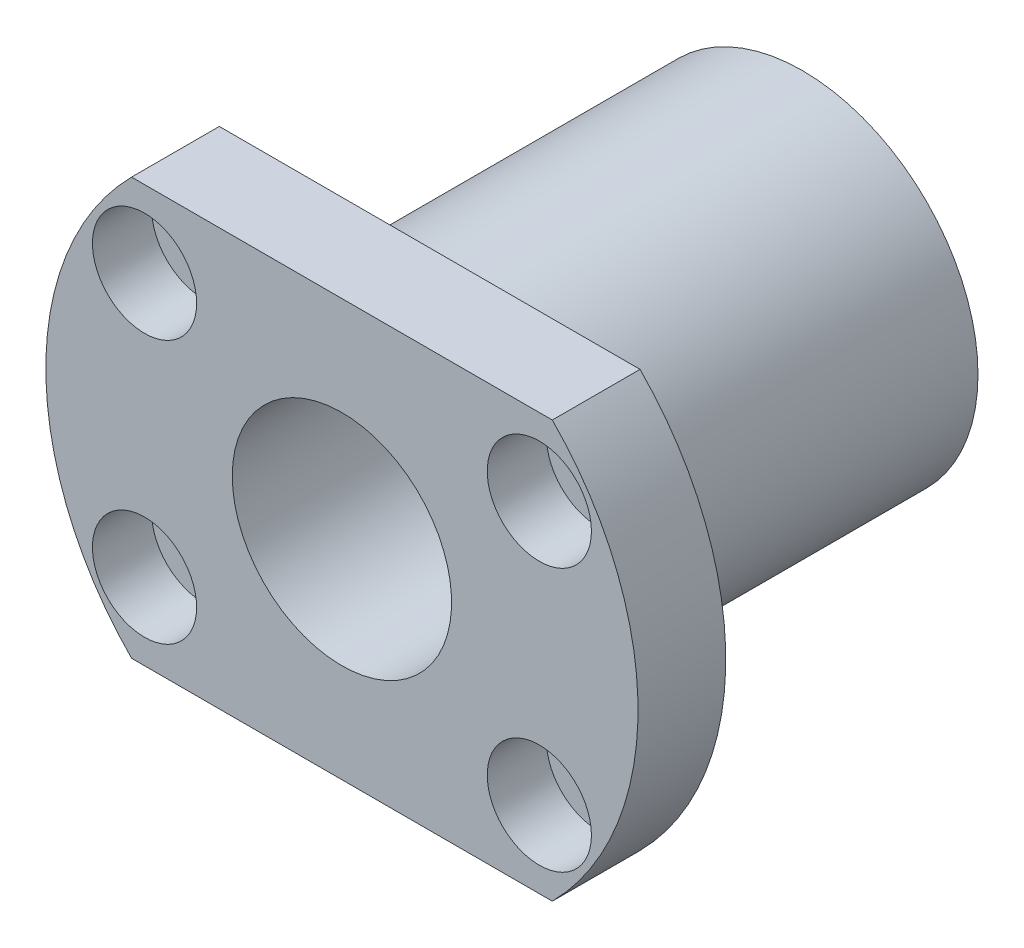
ISO-10303-21;
HEADER;
FILE_DESCRIPTION(('STEP AP214'),'2;1');
FILE_NAME('part.step','',(''),(''),'','','');
FILE_SCHEMA(('AUTOMOTIVE_DESIGN { 1 0 10303 214 1 1 1 1 }'));
ENDSEC;
DATA;
#1=APPLICATION_CONTEXT('core data for automotive mechanical design processes');
#2=APPLICATION_PROTOCOL_DEFINITION('international standard','automotive_design',2000,#1);
#3=PRODUCT_CONTEXT('',#1,'mechanical');
#4=PRODUCT('Part','Part','',(#3));
#5=PRODUCT_RELATED_PRODUCT_CATEGORY('part','',(#4));
#6=PRODUCT_DEFINITION_FORMATION('','',#4);
#7=PRODUCT_DEFINITION_CONTEXT('part definition',#1,'design');
#8=PRODUCT_DEFINITION('design','',#6,#7);
#9=PRODUCT_DEFINITION_SHAPE('','',#8);
#10=(LENGTH_UNIT() NAMED_UNIT(*) SI_UNIT(.MILLI.,.METRE.));
#11=(NAMED_UNIT(*) PLANE_ANGLE_UNIT() SI_UNIT($,.RADIAN.));
#12=(NAMED_UNIT(*) SI_UNIT($,.STERADIAN.) SOLID_ANGLE_UNIT());
#13=UNCERTAINTY_MEASURE_WITH_UNIT(LENGTH_MEASURE(1.E-05),#10,'distance_accuracy_value','');
#14=(GEOMETRIC_REPRESENTATION_CONTEXT(3) GLOBAL_UNCERTAINTY_ASSIGNED_CONTEXT((#13)) GLOBAL_UNIT_ASSIGNED_CONTEXT((#10,
#11,#12)) REPRESENTATION_CONTEXT('',''));
#15=CARTESIAN_POINT('',(0.,0.,0.));
#16=DIRECTION('',(0.,0.,1.));
#17=DIRECTION('',(1.,0.,0.));
#18=AXIS2_PLACEMENT_3D('',#15,#16,#17);
#19=CARTESIAN_POINT('',(-10.,0.,42.));
#20=DIRECTION('',(0.,0.,-1.));
#21=DIRECTION('',(-1.,0.,0.));
#22=AXIS2_PLACEMENT_3D('',#19,#20,#21);
#23=PLANE('',#22);
#24=CARTESIAN_POINT('',(-18.,12.,42.));
#25=DIRECTION('',(0.,0.,1.));
#26=DIRECTION('',(1.,0.,0.));
#27=AXIS2_PLACEMENT_3D('',#24,#25,#26);
#28=CIRCLE('',#27,4.75000000000001);
#29=CARTESIAN_POINT('',(-13.25,12.,42.));
#30=VERTEX_POINT('',#29);
#31=EDGE_CURVE('E150',#30,#30,#28,.T.);
#32=ORIENTED_EDGE('',*,*,#31,.F.);
#33=EDGE_LOOP('',(#32));
#34=FACE_BOUND('',#33,.T.);
#35=CARTESIAN_POINT('',(18.,-12.,42.));
#36=DIRECTION('',(0.,0.,1.));
#37=DIRECTION('',(1.,0.,0.));
#38=AXIS2_PLACEMENT_3D('',#35,#36,#37);
#39=CIRCLE('',#38,4.75000000000001);
#40=CARTESIAN_POINT('',(22.75,-12.,42.));
#41=VERTEX_POINT('',#40);
#42=EDGE_CURVE('E126',#41,#41,#39,.T.);
#43=ORIENTED_EDGE('',*,*,#42,.F.);
#44=EDGE_LOOP('',(#43));
#45=FACE_BOUND('',#44,.T.);
#46=CARTESIAN_POINT('',(0.,0.,42.));
#47=DIRECTION('',(0.,0.,-1.));
#48=DIRECTION('',(-1.,0.,0.));
#49=AXIS2_PLACEMENT_3D('',#46,#47,#48);
#50=CIRCLE('',#49,10.);
#51=CARTESIAN_POINT('',(-10.,0.,42.));
#52=VERTEX_POINT('',#51);
#53=EDGE_CURVE('E107',#52,#52,#50,.T.);
#54=ORIENTED_EDGE('',*,*,#53,.T.);
#55=EDGE_LOOP('',(#54));
#56=FACE_BOUND('',#55,.T.);
#57=DIRECTION('',(-1.,0.,0.));
#58=VECTOR('',#57,1.);
#59=CARTESIAN_POINT('',(-10.,-19.,42.));
#60=LINE('',#59,#58);
#61=CARTESIAN_POINT('',(19.1833260932509,-19.,42.));
#62=VERTEX_POINT('',#61);
#63=CARTESIAN_POINT('',(-19.1833260932509,-19.,42.));
#64=VERTEX_POINT('',#63);
#65=EDGE_CURVE('E12',#62,#64,#60,.T.);
#66=ORIENTED_EDGE('',*,*,#65,.F.);
#67=CARTESIAN_POINT('',(0.,0.,42.));
#68=DIRECTION('',(0.,0.,-1.));
#69=DIRECTION('',(-1.,0.,0.));
#70=AXIS2_PLACEMENT_3D('',#67,#68,#69);
#71=CIRCLE('',#70,27.);
#72=CARTESIAN_POINT('',(19.1833260932509,19.,42.));
#73=VERTEX_POINT('',#72);
#74=EDGE_CURVE('E50',#73,#62,#71,.T.);
#75=ORIENTED_EDGE('',*,*,#74,.F.);
#76=DIRECTION('',(1.,0.,0.));
#77=VECTOR('',#76,1.);
#78=CARTESIAN_POINT('',(-10.,19.,42.));
#79=LINE('',#78,#77);
#80=CARTESIAN_POINT('',(-19.1833260932509,19.,42.));
#81=VERTEX_POINT('',#80);
#82=EDGE_CURVE('E43',#81,#73,#79,.T.);
#83=ORIENTED_EDGE('',*,*,#82,.F.);
#84=EDGE_CURVE('E90',#64,#81,#71,.T.);
#85=ORIENTED_EDGE('',*,*,#84,.F.);
#86=EDGE_LOOP('',(#66,#75,#83,#85));
#87=FACE_BOUND('',#86,.T.);
#88=CARTESIAN_POINT('',(18.,12.,42.));
#89=DIRECTION('',(0.,0.,1.));
#90=DIRECTION('',(1.,0.,0.));
#91=AXIS2_PLACEMENT_3D('',#88,#89,#90);
#92=CIRCLE('',#91,4.75000000000001);
#93=CARTESIAN_POINT('',(22.75,12.,42.));
#94=VERTEX_POINT('',#93);
#95=EDGE_CURVE('E138',#94,#94,#92,.T.);
#96=ORIENTED_EDGE('',*,*,#95,.F.);
#97=EDGE_LOOP('',(#96));
#98=FACE_BOUND('',#97,.T.);
#99=CARTESIAN_POINT('',(-18.,-12.,42.));
#100=DIRECTION('',(0.,0.,1.));
#101=DIRECTION('',(1.,0.,0.));
#102=AXIS2_PLACEMENT_3D('',#99,#100,#101);
#103=CIRCLE('',#102,4.75000000000001);
#104=CARTESIAN_POINT('',(-13.25,-12.,42.));
#105=VERTEX_POINT('',#104);
#106=EDGE_CURVE('E162',#105,#105,#103,.T.);
#107=ORIENTED_EDGE('',*,*,#106,.F.);
#108=EDGE_LOOP('',(#107));
#109=FACE_BOUND('',#108,.T.);
#110=ADVANCED_FACE('F35',(#34,#45,#56,#87,#98,#109),#23,.F.);
#111=CARTESIAN_POINT('',(0.,0.,0.));
#112=DIRECTION('',(0.,0.,-1.));
#113=DIRECTION('',(-1.,0.,0.));
#114=AXIS2_PLACEMENT_3D('',#111,#112,#113);
#115=CYLINDRICAL_SURFACE('',#114,27.);
#116=ORIENTED_EDGE('',*,*,#74,.T.);
#117=DIRECTION('',(0.,0.,-1.));
#118=VECTOR('',#117,1.);
#119=CARTESIAN_POINT('',(19.1833260932509,-19.,0.));
#120=LINE('',#119,#118);
#121=CARTESIAN_POINT('',(19.1833260932509,-19.,34.));
#122=VERTEX_POINT('',#121);
#123=EDGE_CURVE('E113',#122,#62,#120,.F.);
#124=ORIENTED_EDGE('',*,*,#123,.F.);
#125=CARTESIAN_POINT('',(0.,0.,34.));
#126=DIRECTION('',(0.,0.,-1.));
#127=DIRECTION('',(-1.,0.,0.));
#128=AXIS2_PLACEMENT_3D('',#125,#126,#127);
#129=CIRCLE('',#128,27.);
#130=CARTESIAN_POINT('',(19.1833260932509,19.,34.));
#131=VERTEX_POINT('',#130);
#132=EDGE_CURVE('E95',#131,#122,#129,.T.);
#133=ORIENTED_EDGE('',*,*,#132,.F.);
#134=DIRECTION('',(0.,0.,-1.));
#135=VECTOR('',#134,1.);
#136=CARTESIAN_POINT('',(19.1833260932509,19.,0.));
#137=LINE('',#136,#135);
#138=EDGE_CURVE('E78',#73,#131,#137,.T.);
#139=ORIENTED_EDGE('',*,*,#138,.F.);
#140=EDGE_LOOP('',(#116,#124,#133,#139));
#141=FACE_BOUND('',#140,.T.);
#142=ADVANCED_FACE('F37',(#141),#115,.T.);
#143=DIRECTION('',(0.,0.,-1.));
#144=VECTOR('',#143,1.);
#145=CARTESIAN_POINT('',(-19.1833260932509,19.,0.));
#146=LINE('',#145,#144);
#147=CARTESIAN_POINT('',(-19.1833260932509,19.,34.));
#148=VERTEX_POINT('',#147);
#149=EDGE_CURVE('E58',#148,#81,#146,.F.);
#150=ORIENTED_EDGE('',*,*,#149,.F.);
#151=CARTESIAN_POINT('',(-19.1833260932509,-19.,34.));
#152=VERTEX_POINT('',#151);
#153=EDGE_CURVE('E88',#152,#148,#129,.T.);
#154=ORIENTED_EDGE('',*,*,#153,.F.);
#155=DIRECTION('',(0.,0.,-1.));
#156=VECTOR('',#155,1.);
#157=CARTESIAN_POINT('',(-19.1833260932509,-19.,0.));
#158=LINE('',#157,#156);
#159=EDGE_CURVE('E111',#64,#152,#158,.T.);
#160=ORIENTED_EDGE('',*,*,#159,.F.);
#161=ORIENTED_EDGE('',*,*,#84,.T.);
#162=EDGE_LOOP('',(#150,#154,#160,#161));
#163=FACE_BOUND('',#162,.T.);
#164=ADVANCED_FACE('F86',(#163),#115,.T.);
#165=CARTESIAN_POINT('',(-16.,0.,34.));
#166=DIRECTION('',(0.,0.,1.));
#167=DIRECTION('',(1.,0.,0.));
#168=AXIS2_PLACEMENT_3D('',#165,#166,#167);
#169=PLANE('',#168);
#170=CARTESIAN_POINT('',(-18.,-12.,34.));
#171=DIRECTION('',(0.,0.,1.));
#172=DIRECTION('',(1.,0.,0.));
#173=AXIS2_PLACEMENT_3D('',#170,#171,#172);
#174=CIRCLE('',#173,2.75000000000001);
#175=CARTESIAN_POINT('',(-15.25,-12.,34.));
#176=VERTEX_POINT('',#175);
#177=EDGE_CURVE('E153',#176,#176,#174,.T.);
#178=ORIENTED_EDGE('',*,*,#177,.T.);
#179=EDGE_LOOP('',(#178));
#180=FACE_BOUND('',#179,.T.);
#181=CARTESIAN_POINT('',(-18.,12.,34.));
#182=DIRECTION('',(0.,0.,1.));
#183=DIRECTION('',(1.,0.,0.));
#184=AXIS2_PLACEMENT_3D('',#181,#182,#183);
#185=CIRCLE('',#184,2.75000000000001);
#186=CARTESIAN_POINT('',(-15.25,12.,34.));
#187=VERTEX_POINT('',#186);
#188=EDGE_CURVE('E141',#187,#187,#185,.T.);
#189=ORIENTED_EDGE('',*,*,#188,.T.);
#190=EDGE_LOOP('',(#189));
#191=FACE_BOUND('',#190,.T.);
#192=CARTESIAN_POINT('',(18.,12.,34.));
#193=DIRECTION('',(0.,0.,1.));
#194=DIRECTION('',(1.,0.,0.));
#195=AXIS2_PLACEMENT_3D('',#192,#193,#194);
#196=CIRCLE('',#195,2.75000000000001);
#197=CARTESIAN_POINT('',(20.75,12.,34.));
#198=VERTEX_POINT('',#197);
#199=EDGE_CURVE('E129',#198,#198,#196,.T.);
#200=ORIENTED_EDGE('',*,*,#199,.T.);
#201=EDGE_LOOP('',(#200));
#202=FACE_BOUND('',#201,.T.);
#203=CARTESIAN_POINT('',(18.,-12.,34.));
#204=DIRECTION('',(0.,0.,1.));
#205=DIRECTION('',(1.,0.,0.));
#206=AXIS2_PLACEMENT_3D('',#203,#204,#205);
#207=CIRCLE('',#206,2.75000000000001);
#208=CARTESIAN_POINT('',(20.75,-12.,34.));
#209=VERTEX_POINT('',#208);
#210=EDGE_CURVE('E116',#209,#209,#207,.T.);
#211=ORIENTED_EDGE('',*,*,#210,.T.);
#212=EDGE_LOOP('',(#211));
#213=FACE_BOUND('',#212,.T.);
#214=CARTESIAN_POINT('',(0.,0.,34.));
#215=DIRECTION('',(0.,0.,-1.));
#216=DIRECTION('',(-1.,0.,0.));
#217=AXIS2_PLACEMENT_3D('',#214,#215,#216);
#218=CIRCLE('',#217,16.);
#219=CARTESIAN_POINT('',(-16.,0.,34.));
#220=VERTEX_POINT('',#219);
#221=EDGE_CURVE('E97',#220,#220,#218,.T.);
#222=ORIENTED_EDGE('',*,*,#221,.F.);
#223=EDGE_LOOP('',(#222));
#224=FACE_BOUND('',#223,.T.);
#225=DIRECTION('',(-1.,0.,0.));
#226=VECTOR('',#225,1.);
#227=CARTESIAN_POINT('',(27.,-19.,34.));
#228=LINE('',#227,#226);
#229=EDGE_CURVE('E82',#122,#152,#228,.T.);
#230=ORIENTED_EDGE('',*,*,#229,.T.);
#231=ORIENTED_EDGE('',*,*,#153,.T.);
#232=DIRECTION('',(1.,0.,0.));
#233=VECTOR('',#232,1.);
#234=CARTESIAN_POINT('',(27.,19.,34.));
#235=LINE('',#234,#233);
#236=EDGE_CURVE('E76',#148,#131,#235,.T.);
#237=ORIENTED_EDGE('',*,*,#236,.T.);
#238=ORIENTED_EDGE('',*,*,#132,.T.);
#239=EDGE_LOOP('',(#230,#231,#237,#238));
#240=FACE_BOUND('',#239,.T.);
#241=ADVANCED_FACE('F93',(#180,#191,#202,#213,#224,#240),#169,.F.);
#242=CARTESIAN_POINT('',(0.,0.,0.));
#243=DIRECTION('',(0.,0.,-1.));
#244=DIRECTION('',(-1.,0.,0.));
#245=AXIS2_PLACEMENT_3D('',#242,#243,#244);
#246=CYLINDRICAL_SURFACE('',#245,16.);
#247=CARTESIAN_POINT('',(0.,0.,0.));
#248=DIRECTION('',(0.,0.,-1.));
#249=DIRECTION('',(-1.,0.,0.));
#250=AXIS2_PLACEMENT_3D('',#247,#248,#249);
#251=CIRCLE('',#250,16.);
#252=CARTESIAN_POINT('',(-16.,0.,0.));
#253=VERTEX_POINT('',#252);
#254=EDGE_CURVE('E101',#253,#253,#251,.T.);
#255=ORIENTED_EDGE('',*,*,#254,.F.);
#256=EDGE_LOOP('',(#255));
#257=FACE_BOUND('',#256,.T.);
#258=ORIENTED_EDGE('',*,*,#221,.T.);
#259=EDGE_LOOP('',(#258));
#260=FACE_BOUND('',#259,.T.);
#261=ADVANCED_FACE('F189',(#257,#260),#246,.T.);
#262=CARTESIAN_POINT('',(-16.,0.,0.));
#263=DIRECTION('',(0.,0.,1.));
#264=DIRECTION('',(1.,0.,0.));
#265=AXIS2_PLACEMENT_3D('',#262,#263,#264);
#266=PLANE('',#265);
#267=CARTESIAN_POINT('',(0.,0.,0.));
#268=DIRECTION('',(0.,0.,-1.));
#269=DIRECTION('',(-1.,0.,0.));
#270=AXIS2_PLACEMENT_3D('',#267,#268,#269);
#271=CIRCLE('',#270,10.);
#272=CARTESIAN_POINT('',(-10.,0.,0.));
#273=VERTEX_POINT('',#272);
#274=EDGE_CURVE('E104',#273,#273,#271,.T.);
#275=ORIENTED_EDGE('',*,*,#274,.F.);
#276=EDGE_LOOP('',(#275));
#277=FACE_BOUND('',#276,.T.);
#278=ORIENTED_EDGE('',*,*,#254,.T.);
#279=EDGE_LOOP('',(#278));
#280=FACE_BOUND('',#279,.T.);
#281=ADVANCED_FACE('F185',(#277,#280),#266,.F.);
#282=CARTESIAN_POINT('',(0.,0.,0.));
#283=DIRECTION('',(0.,0.,-1.));
#284=DIRECTION('',(-1.,0.,0.));
#285=AXIS2_PLACEMENT_3D('',#282,#283,#284);
#286=CYLINDRICAL_SURFACE('',#285,10.);
#287=ORIENTED_EDGE('',*,*,#53,.F.);
#288=EDGE_LOOP('',(#287));
#289=FACE_BOUND('',#288,.T.);
#290=ORIENTED_EDGE('',*,*,#274,.T.);
#291=EDGE_LOOP('',(#290));
#292=FACE_BOUND('',#291,.T.);
#293=ADVANCED_FACE('F182',(#289,#292),#286,.F.);
#294=CARTESIAN_POINT('',(27.,19.,-45.225499173555));
#295=DIRECTION('',(0.,1.,0.));
#296=DIRECTION('',(0.,0.,1.));
#297=AXIS2_PLACEMENT_3D('',#294,#295,#296);
#298=PLANE('',#297);
#299=ORIENTED_EDGE('',*,*,#138,.T.);
#300=ORIENTED_EDGE('',*,*,#236,.F.);
#301=ORIENTED_EDGE('',*,*,#149,.T.);
#302=ORIENTED_EDGE('',*,*,#82,.T.);
#303=EDGE_LOOP('',(#299,#300,#301,#302));
#304=FACE_BOUND('',#303,.T.);
#305=ADVANCED_FACE('F77',(#304),#298,.T.);
#306=CARTESIAN_POINT('',(27.,-19.,-45.225499173555));
#307=DIRECTION('',(0.,-1.,0.));
#308=DIRECTION('',(0.,0.,-1.));
#309=AXIS2_PLACEMENT_3D('',#306,#307,#308);
#310=PLANE('',#309);
#311=ORIENTED_EDGE('',*,*,#159,.T.);
#312=ORIENTED_EDGE('',*,*,#229,.F.);
#313=ORIENTED_EDGE('',*,*,#123,.T.);
#314=ORIENTED_EDGE('',*,*,#65,.T.);
#315=EDGE_LOOP('',(#311,#312,#313,#314));
#316=FACE_BOUND('',#315,.T.);
#317=ADVANCED_FACE('F180',(#316),#310,.T.);
#318=CARTESIAN_POINT('',(18.,-12.,42.));
#319=DIRECTION('',(0.,0.,1.));
#320=DIRECTION('',(1.,0.,0.));
#321=AXIS2_PLACEMENT_3D('',#318,#319,#320);
#322=CYLINDRICAL_SURFACE('',#321,2.75000000000001);
#323=ORIENTED_EDGE('',*,*,#210,.F.);
#324=EDGE_LOOP('',(#323));
#325=FACE_BOUND('',#324,.T.);
#326=CARTESIAN_POINT('',(18.,-12.,36.6));
#327=DIRECTION('',(0.,0.,1.));
#328=DIRECTION('',(1.,0.,0.));
#329=AXIS2_PLACEMENT_3D('',#326,#327,#328);
#330=CIRCLE('',#329,2.75000000000001);
#331=CARTESIAN_POINT('',(20.75,-12.,36.6));
#332=VERTEX_POINT('',#331);
#333=EDGE_CURVE('E120',#332,#332,#330,.T.);
#334=ORIENTED_EDGE('',*,*,#333,.T.);
#335=EDGE_LOOP('',(#334));
#336=FACE_BOUND('',#335,.T.);
#337=ADVANCED_FACE('F209',(#325,#336),#322,.F.);
#338=CARTESIAN_POINT('',(20.75,-12.,36.6));
#339=DIRECTION('',(0.,0.,-1.));
#340=DIRECTION('',(-1.,0.,0.));
#341=AXIS2_PLACEMENT_3D('',#338,#339,#340);
#342=PLANE('',#341);
#343=ORIENTED_EDGE('',*,*,#333,.F.);
#344=EDGE_LOOP('',(#343));
#345=FACE_BOUND('',#344,.T.);
#346=CARTESIAN_POINT('',(18.,-12.,36.6));
#347=DIRECTION('',(0.,0.,1.));
#348=DIRECTION('',(1.,0.,0.));
#349=AXIS2_PLACEMENT_3D('',#346,#347,#348);
#350=CIRCLE('',#349,4.75000000000001);
#351=CARTESIAN_POINT('',(22.75,-12.,36.6));
#352=VERTEX_POINT('',#351);
#353=EDGE_CURVE('E123',#352,#352,#350,.T.);
#354=ORIENTED_EDGE('',*,*,#353,.T.);
#355=EDGE_LOOP('',(#354));
#356=FACE_BOUND('',#355,.T.);
#357=ADVANCED_FACE('F212',(#345,#356),#342,.F.);
#358=CARTESIAN_POINT('',(18.,-12.,42.));
#359=DIRECTION('',(0.,0.,1.));
#360=DIRECTION('',(1.,0.,0.));
#361=AXIS2_PLACEMENT_3D('',#358,#359,#360);
#362=CYLINDRICAL_SURFACE('',#361,4.75000000000001);
#363=ORIENTED_EDGE('',*,*,#353,.F.);
#364=EDGE_LOOP('',(#363));
#365=FACE_BOUND('',#364,.T.);
#366=ORIENTED_EDGE('',*,*,#42,.T.);
#367=EDGE_LOOP('',(#366));
#368=FACE_BOUND('',#367,.T.);
#369=ADVANCED_FACE('F218',(#365,#368),#362,.F.);
#370=CARTESIAN_POINT('',(18.,12.,42.));
#371=DIRECTION('',(0.,0.,1.));
#372=DIRECTION('',(1.,0.,0.));
#373=AXIS2_PLACEMENT_3D('',#370,#371,#372);
#374=CYLINDRICAL_SURFACE('',#373,2.75000000000001);
#375=ORIENTED_EDGE('',*,*,#199,.F.);
#376=EDGE_LOOP('',(#375));
#377=FACE_BOUND('',#376,.T.);
#378=CARTESIAN_POINT('',(18.,12.,36.6));
#379=DIRECTION('',(0.,0.,1.));
#380=DIRECTION('',(1.,0.,0.));
#381=AXIS2_PLACEMENT_3D('',#378,#379,#380);
#382=CIRCLE('',#381,2.75000000000001);
#383=CARTESIAN_POINT('',(20.75,12.,36.6));
#384=VERTEX_POINT('',#383);
#385=EDGE_CURVE('E132',#384,#384,#382,.T.);
#386=ORIENTED_EDGE('',*,*,#385,.T.);
#387=EDGE_LOOP('',(#386));
#388=FACE_BOUND('',#387,.T.);
#389=ADVANCED_FACE('F224',(#377,#388),#374,.F.);
#390=CARTESIAN_POINT('',(20.75,12.,36.6));
#391=DIRECTION('',(0.,0.,-1.));
#392=DIRECTION('',(-1.,0.,0.));
#393=AXIS2_PLACEMENT_3D('',#390,#391,#392);
#394=PLANE('',#393);
#395=ORIENTED_EDGE('',*,*,#385,.F.);
#396=EDGE_LOOP('',(#395));
#397=FACE_BOUND('',#396,.T.);
#398=CARTESIAN_POINT('',(18.,12.,36.6));
#399=DIRECTION('',(0.,0.,1.));
#400=DIRECTION('',(1.,0.,0.));
#401=AXIS2_PLACEMENT_3D('',#398,#399,#400);
#402=CIRCLE('',#401,4.75000000000001);
#403=CARTESIAN_POINT('',(22.75,12.,36.6));
#404=VERTEX_POINT('',#403);
#405=EDGE_CURVE('E135',#404,#404,#402,.T.);
#406=ORIENTED_EDGE('',*,*,#405,.T.);
#407=EDGE_LOOP('',(#406));
#408=FACE_BOUND('',#407,.T.);
#409=ADVANCED_FACE('F237',(#397,#408),#394,.F.);
#410=CARTESIAN_POINT('',(18.,12.,42.));
#411=DIRECTION('',(0.,0.,1.));
#412=DIRECTION('',(1.,0.,0.));
#413=AXIS2_PLACEMENT_3D('',#410,#411,#412);
#414=CYLINDRICAL_SURFACE('',#413,4.75000000000001);
#415=ORIENTED_EDGE('',*,*,#405,.F.);
#416=EDGE_LOOP('',(#415));
#417=FACE_BOUND('',#416,.T.);
#418=ORIENTED_EDGE('',*,*,#95,.T.);
#419=EDGE_LOOP('',(#418));
#420=FACE_BOUND('',#419,.T.);
#421=ADVANCED_FACE('F234',(#417,#420),#414,.F.);
#422=CARTESIAN_POINT('',(-18.,12.,42.));
#423=DIRECTION('',(0.,0.,1.));
#424=DIRECTION('',(1.,0.,0.));
#425=AXIS2_PLACEMENT_3D('',#422,#423,#424);
#426=CYLINDRICAL_SURFACE('',#425,2.75000000000001);
#427=ORIENTED_EDGE('',*,*,#188,.F.);
#428=EDGE_LOOP('',(#427));
#429=FACE_BOUND('',#428,.T.);
#430=CARTESIAN_POINT('',(-18.,12.,36.6));
#431=DIRECTION('',(0.,0.,1.));
#432=DIRECTION('',(1.,0.,0.));
#433=AXIS2_PLACEMENT_3D('',#430,#431,#432);
#434=CIRCLE('',#433,2.75000000000001);
#435=CARTESIAN_POINT('',(-15.25,12.,36.6));
#436=VERTEX_POINT('',#435);
#437=EDGE_CURVE('E144',#436,#436,#434,.T.);
#438=ORIENTED_EDGE('',*,*,#437,.T.);
#439=EDGE_LOOP('',(#438));
#440=FACE_BOUND('',#439,.T.);
#441=ADVANCED_FACE('F236',(#429,#440),#426,.F.);
#442=CARTESIAN_POINT('',(-15.25,12.,36.6));
#443=DIRECTION('',(0.,0.,-1.));
#444=DIRECTION('',(-1.,0.,0.));
#445=AXIS2_PLACEMENT_3D('',#442,#443,#444);
#446=PLANE('',#445);
#447=ORIENTED_EDGE('',*,*,#437,.F.);
#448=EDGE_LOOP('',(#447));
#449=FACE_BOUND('',#448,.T.);
#450=CARTESIAN_POINT('',(-18.,12.,36.6));
#451=DIRECTION('',(0.,0.,1.));
#452=DIRECTION('',(1.,0.,0.));
#453=AXIS2_PLACEMENT_3D('',#450,#451,#452);
#454=CIRCLE('',#453,4.75000000000001);
#455=CARTESIAN_POINT('',(-13.25,12.,36.6));
#456=VERTEX_POINT('',#455);
#457=EDGE_CURVE('E147',#456,#456,#454,.T.);
#458=ORIENTED_EDGE('',*,*,#457,.T.);
#459=EDGE_LOOP('',(#458));
#460=FACE_BOUND('',#459,.T.);
#461=ADVANCED_FACE('F244',(#449,#460),#446,.F.);
#462=CARTESIAN_POINT('',(-18.,12.,42.));
#463=DIRECTION('',(0.,0.,1.));
#464=DIRECTION('',(1.,0.,0.));
#465=AXIS2_PLACEMENT_3D('',#462,#463,#464);
#466=CYLINDRICAL_SURFACE('',#465,4.75000000000001);
#467=ORIENTED_EDGE('',*,*,#457,.F.);
#468=EDGE_LOOP('',(#467));
#469=FACE_BOUND('',#468,.T.);
#470=ORIENTED_EDGE('',*,*,#31,.T.);
#471=EDGE_LOOP('',(#470));
#472=FACE_BOUND('',#471,.T.);
#473=ADVANCED_FACE('F298',(#469,#472),#466,.F.);
#474=CARTESIAN_POINT('',(-18.,-12.,42.));
#475=DIRECTION('',(0.,0.,1.));
#476=DIRECTION('',(1.,0.,0.));
#477=AXIS2_PLACEMENT_3D('',#474,#475,#476);
#478=CYLINDRICAL_SURFACE('',#477,2.75000000000001);
#479=ORIENTED_EDGE('',*,*,#177,.F.);
#480=EDGE_LOOP('',(#479));
#481=FACE_BOUND('',#480,.T.);
#482=CARTESIAN_POINT('',(-18.,-12.,36.6));
#483=DIRECTION('',(0.,0.,1.));
#484=DIRECTION('',(1.,0.,0.));
#485=AXIS2_PLACEMENT_3D('',#482,#483,#484);
#486=CIRCLE('',#485,2.75000000000001);
#487=CARTESIAN_POINT('',(-15.25,-12.,36.6));
#488=VERTEX_POINT('',#487);
#489=EDGE_CURVE('E156',#488,#488,#486,.T.);
#490=ORIENTED_EDGE('',*,*,#489,.T.);
#491=EDGE_LOOP('',(#490));
#492=FACE_BOUND('',#491,.T.);
#493=ADVANCED_FACE('F307',(#481,#492),#478,.F.);
#494=CARTESIAN_POINT('',(-15.25,-12.,36.6));
#495=DIRECTION('',(0.,0.,-1.));
#496=DIRECTION('',(-1.,0.,0.));
#497=AXIS2_PLACEMENT_3D('',#494,#495,#496);
#498=PLANE('',#497);
#499=ORIENTED_EDGE('',*,*,#489,.F.);
#500=EDGE_LOOP('',(#499));
#501=FACE_BOUND('',#500,.T.);
#502=CARTESIAN_POINT('',(-18.,-12.,36.6));
#503=DIRECTION('',(0.,0.,1.));
#504=DIRECTION('',(1.,0.,0.));
#505=AXIS2_PLACEMENT_3D('',#502,#503,#504);
#506=CIRCLE('',#505,4.75000000000001);
#507=CARTESIAN_POINT('',(-13.25,-12.,36.6));
#508=VERTEX_POINT('',#507);
#509=EDGE_CURVE('E159',#508,#508,#506,.T.);
#510=ORIENTED_EDGE('',*,*,#509,.T.);
#511=EDGE_LOOP('',(#510));
#512=FACE_BOUND('',#511,.T.);
#513=ADVANCED_FACE('F317',(#501,#512),#498,.F.);
#514=CARTESIAN_POINT('',(-18.,-12.,42.));
#515=DIRECTION('',(0.,0.,1.));
#516=DIRECTION('',(1.,0.,0.));
#517=AXIS2_PLACEMENT_3D('',#514,#515,#516);
#518=CYLINDRICAL_SURFACE('',#517,4.75000000000001);
#519=ORIENTED_EDGE('',*,*,#509,.F.);
#520=EDGE_LOOP('',(#519));
#521=FACE_BOUND('',#520,.T.);
#522=ORIENTED_EDGE('',*,*,#106,.T.);
#523=EDGE_LOOP('',(#522));
#524=FACE_BOUND('',#523,.T.);
#525=ADVANCED_FACE('F166',(#521,#524),#518,.F.);
#526=CLOSED_SHELL('',(#110,#142,#164,#241,#261,#281,#293,#305,#317,#337,#357,#369,#389,#409,
#421,#441,#461,#473,#493,#513,#525));
#527=MANIFOLD_SOLID_BREP('B2',#526);
#528=ADVANCED_BREP_SHAPE_REPRESENTATION('',(#18,#527),#14);
#529=SHAPE_DEFINITION_REPRESENTATION(#9,#528);
ENDSEC;
END-ISO-10303-21;
